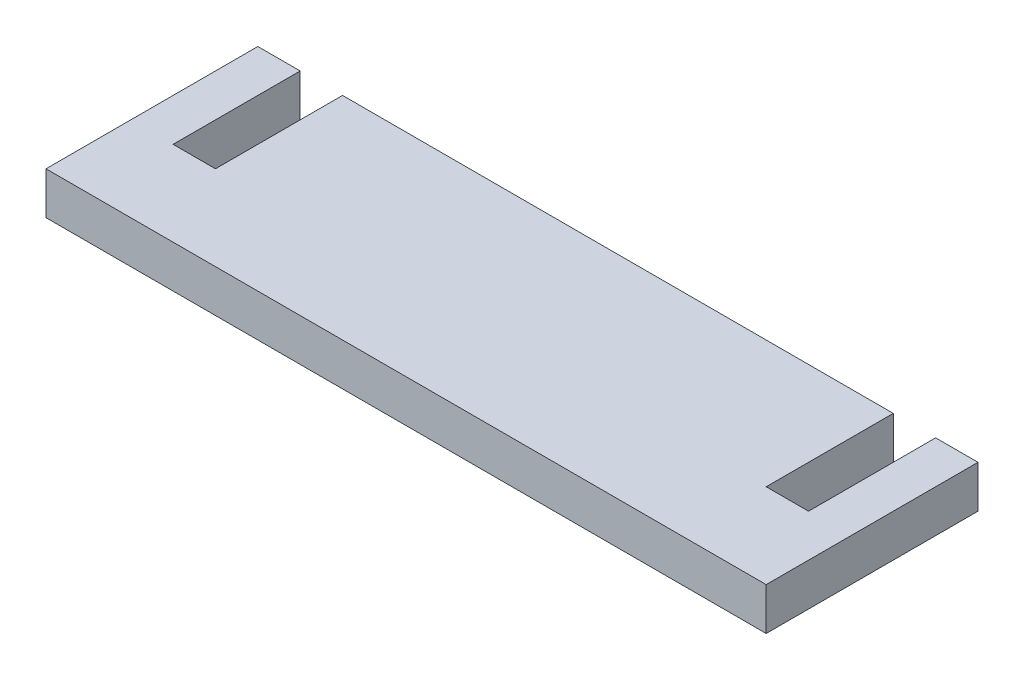
ISO-10303-21;
HEADER;
FILE_DESCRIPTION(('STEP AP214'),'2;1');
FILE_NAME('part.step','',(''),(''),'','','');
FILE_SCHEMA(('AUTOMOTIVE_DESIGN { 1 0 10303 214 1 1 1 1 }'));
ENDSEC;
DATA;
#1=APPLICATION_CONTEXT('core data for automotive mechanical design processes');
#2=APPLICATION_PROTOCOL_DEFINITION('international standard','automotive_design',2000,#1);
#3=PRODUCT_CONTEXT('',#1,'mechanical');
#4=PRODUCT('Part','Part','',(#3));
#5=PRODUCT_RELATED_PRODUCT_CATEGORY('part','',(#4));
#6=PRODUCT_DEFINITION_FORMATION('','',#4);
#7=PRODUCT_DEFINITION_CONTEXT('part definition',#1,'design');
#8=PRODUCT_DEFINITION('design','',#6,#7);
#9=PRODUCT_DEFINITION_SHAPE('','',#8);
#10=(LENGTH_UNIT() NAMED_UNIT(*) SI_UNIT(.MILLI.,.METRE.));
#11=(NAMED_UNIT(*) PLANE_ANGLE_UNIT() SI_UNIT($,.RADIAN.));
#12=(NAMED_UNIT(*) SI_UNIT($,.STERADIAN.) SOLID_ANGLE_UNIT());
#13=UNCERTAINTY_MEASURE_WITH_UNIT(LENGTH_MEASURE(1.E-05),#10,'distance_accuracy_value','');
#14=(GEOMETRIC_REPRESENTATION_CONTEXT(3) GLOBAL_UNCERTAINTY_ASSIGNED_CONTEXT((#13)) GLOBAL_UNIT_ASSIGNED_CONTEXT((#10,
#11,#12)) REPRESENTATION_CONTEXT('',''));
#15=CARTESIAN_POINT('',(0.,0.,0.));
#16=DIRECTION('',(0.,0.,1.));
#17=DIRECTION('',(1.,0.,0.));
#18=AXIS2_PLACEMENT_3D('',#15,#16,#17);
#19=CARTESIAN_POINT('',(0.,254.,-1270.));
#20=DIRECTION('',(-1.,0.,0.));
#21=DIRECTION('',(0.,0.,1.));
#22=AXIS2_PLACEMENT_3D('',#19,#20,#21);
#23=PLANE('',#22);
#24=DIRECTION('',(0.,0.,-1.));
#25=VECTOR('',#24,1.);
#26=CARTESIAN_POINT('',(0.,0.,-1270.));
#27=LINE('',#26,#25);
#28=CARTESIAN_POINT('',(0.,0.,0.));
#29=VERTEX_POINT('',#28);
#30=CARTESIAN_POINT('',(0.,0.,-1270.));
#31=VERTEX_POINT('',#30);
#32=EDGE_CURVE('E153',#29,#31,#27,.T.);
#33=ORIENTED_EDGE('',*,*,#32,.T.);
#34=DIRECTION('',(0.,-1.,0.));
#35=VECTOR('',#34,1.);
#36=CARTESIAN_POINT('',(0.,254.,-1270.));
#37=LINE('',#36,#35);
#38=CARTESIAN_POINT('',(0.,254.,-1270.));
#39=VERTEX_POINT('',#38);
#40=EDGE_CURVE('E11',#39,#31,#37,.T.);
#41=ORIENTED_EDGE('',*,*,#40,.F.);
#42=DIRECTION('',(0.,0.,-1.));
#43=VECTOR('',#42,1.);
#44=CARTESIAN_POINT('',(0.,254.,-1270.));
#45=LINE('',#44,#43);
#46=CARTESIAN_POINT('',(0.,254.,0.));
#47=VERTEX_POINT('',#46);
#48=EDGE_CURVE('E175',#47,#39,#45,.T.);
#49=ORIENTED_EDGE('',*,*,#48,.F.);
#50=DIRECTION('',(0.,-1.,0.));
#51=VECTOR('',#50,1.);
#52=CARTESIAN_POINT('',(0.,254.,0.));
#53=LINE('',#52,#51);
#54=EDGE_CURVE('E149',#47,#29,#53,.T.);
#55=ORIENTED_EDGE('',*,*,#54,.T.);
#56=EDGE_LOOP('',(#33,#41,#49,#55));
#57=FACE_BOUND('',#56,.T.);
#58=ADVANCED_FACE('F33',(#57),#23,.F.);
#59=CARTESIAN_POINT('',(-254.,254.,-1270.));
#60=DIRECTION('',(0.,0.,1.));
#61=DIRECTION('',(1.,0.,0.));
#62=AXIS2_PLACEMENT_3D('',#59,#60,#61);
#63=PLANE('',#62);
#64=DIRECTION('',(-1.,0.,0.));
#65=VECTOR('',#64,1.);
#66=CARTESIAN_POINT('',(-254.,0.,-1270.));
#67=LINE('',#66,#65);
#68=CARTESIAN_POINT('',(-254.,0.,-1270.));
#69=VERTEX_POINT('',#68);
#70=EDGE_CURVE('E156',#31,#69,#67,.T.);
#71=ORIENTED_EDGE('',*,*,#70,.T.);
#72=DIRECTION('',(0.,-1.,0.));
#73=VECTOR('',#72,1.);
#74=CARTESIAN_POINT('',(-254.,254.,-1270.));
#75=LINE('',#74,#73);
#76=CARTESIAN_POINT('',(-254.,254.,-1270.));
#77=VERTEX_POINT('',#76);
#78=EDGE_CURVE('E41',#77,#69,#75,.T.);
#79=ORIENTED_EDGE('',*,*,#78,.F.);
#80=DIRECTION('',(-1.,0.,0.));
#81=VECTOR('',#80,1.);
#82=CARTESIAN_POINT('',(-254.,254.,-1270.));
#83=LINE('',#82,#81);
#84=EDGE_CURVE('E104',#39,#77,#83,.T.);
#85=ORIENTED_EDGE('',*,*,#84,.F.);
#86=ORIENTED_EDGE('',*,*,#40,.T.);
#87=EDGE_LOOP('',(#71,#79,#85,#86));
#88=FACE_BOUND('',#87,.T.);
#89=ADVANCED_FACE('F253',(#88),#63,.F.);
#90=CARTESIAN_POINT('',(-254.,254.,-508.));
#91=DIRECTION('',(1.,0.,0.));
#92=DIRECTION('',(0.,0.,-1.));
#93=AXIS2_PLACEMENT_3D('',#90,#91,#92);
#94=PLANE('',#93);
#95=DIRECTION('',(0.,0.,1.));
#96=VECTOR('',#95,1.);
#97=CARTESIAN_POINT('',(-254.,0.,-508.));
#98=LINE('',#97,#96);
#99=CARTESIAN_POINT('',(-254.,0.,-508.));
#100=VERTEX_POINT('',#99);
#101=EDGE_CURVE('E158',#69,#100,#98,.T.);
#102=ORIENTED_EDGE('',*,*,#101,.T.);
#103=DIRECTION('',(0.,-1.,0.));
#104=VECTOR('',#103,1.);
#105=CARTESIAN_POINT('',(-254.,254.,-508.));
#106=LINE('',#105,#104);
#107=CARTESIAN_POINT('',(-254.,254.,-508.));
#108=VERTEX_POINT('',#107);
#109=EDGE_CURVE('E194',#108,#100,#106,.T.);
#110=ORIENTED_EDGE('',*,*,#109,.F.);
#111=DIRECTION('',(0.,0.,1.));
#112=VECTOR('',#111,1.);
#113=CARTESIAN_POINT('',(-254.,254.,-508.));
#114=LINE('',#113,#112);
#115=EDGE_CURVE('E202',#77,#108,#114,.T.);
#116=ORIENTED_EDGE('',*,*,#115,.F.);
#117=ORIENTED_EDGE('',*,*,#78,.T.);
#118=EDGE_LOOP('',(#102,#110,#116,#117));
#119=FACE_BOUND('',#118,.T.);
#120=ADVANCED_FACE('F200',(#119),#94,.F.);
#121=CARTESIAN_POINT('',(-508.,254.,-508.));
#122=DIRECTION('',(0.,0.,1.));
#123=DIRECTION('',(1.,0.,0.));
#124=AXIS2_PLACEMENT_3D('',#121,#122,#123);
#125=PLANE('',#124);
#126=DIRECTION('',(-1.,0.,0.));
#127=VECTOR('',#126,1.);
#128=CARTESIAN_POINT('',(-508.,0.,-508.));
#129=LINE('',#128,#127);
#130=CARTESIAN_POINT('',(-508.,0.,-508.));
#131=VERTEX_POINT('',#130);
#132=EDGE_CURVE('E160',#100,#131,#129,.T.);
#133=ORIENTED_EDGE('',*,*,#132,.T.);
#134=DIRECTION('',(0.,-1.,0.));
#135=VECTOR('',#134,1.);
#136=CARTESIAN_POINT('',(-508.,254.,-508.));
#137=LINE('',#136,#135);
#138=CARTESIAN_POINT('',(-508.,254.,-508.));
#139=VERTEX_POINT('',#138);
#140=EDGE_CURVE('E191',#139,#131,#137,.T.);
#141=ORIENTED_EDGE('',*,*,#140,.F.);
#142=DIRECTION('',(-1.,0.,0.));
#143=VECTOR('',#142,1.);
#144=CARTESIAN_POINT('',(-508.,254.,-508.));
#145=LINE('',#144,#143);
#146=EDGE_CURVE('E220',#108,#139,#145,.T.);
#147=ORIENTED_EDGE('',*,*,#146,.F.);
#148=ORIENTED_EDGE('',*,*,#109,.T.);
#149=EDGE_LOOP('',(#133,#141,#147,#148));
#150=FACE_BOUND('',#149,.T.);
#151=ADVANCED_FACE('F211',(#150),#125,.F.);
#152=CARTESIAN_POINT('',(-508.,254.,-1270.));
#153=DIRECTION('',(-1.,0.,0.));
#154=DIRECTION('',(0.,0.,1.));
#155=AXIS2_PLACEMENT_3D('',#152,#153,#154);
#156=PLANE('',#155);
#157=DIRECTION('',(0.,0.,-1.));
#158=VECTOR('',#157,1.);
#159=CARTESIAN_POINT('',(-508.,0.,-1270.));
#160=LINE('',#159,#158);
#161=CARTESIAN_POINT('',(-508.,0.,-1270.));
#162=VERTEX_POINT('',#161);
#163=EDGE_CURVE('E162',#131,#162,#160,.T.);
#164=ORIENTED_EDGE('',*,*,#163,.T.);
#165=DIRECTION('',(0.,-1.,0.));
#166=VECTOR('',#165,1.);
#167=CARTESIAN_POINT('',(-508.,254.,-1270.));
#168=LINE('',#167,#166);
#169=CARTESIAN_POINT('',(-508.,254.,-1270.));
#170=VERTEX_POINT('',#169);
#171=EDGE_CURVE('E188',#170,#162,#168,.T.);
#172=ORIENTED_EDGE('',*,*,#171,.F.);
#173=DIRECTION('',(0.,0.,-1.));
#174=VECTOR('',#173,1.);
#175=CARTESIAN_POINT('',(-508.,254.,-1270.));
#176=LINE('',#175,#174);
#177=EDGE_CURVE('E217',#139,#170,#176,.T.);
#178=ORIENTED_EDGE('',*,*,#177,.F.);
#179=ORIENTED_EDGE('',*,*,#140,.T.);
#180=EDGE_LOOP('',(#164,#172,#178,#179));
#181=FACE_BOUND('',#180,.T.);
#182=ADVANCED_FACE('F215',(#181),#156,.F.);
#183=CARTESIAN_POINT('',(-3810.,254.,-1270.));
#184=DIRECTION('',(0.,0.,1.));
#185=DIRECTION('',(1.,0.,0.));
#186=AXIS2_PLACEMENT_3D('',#183,#184,#185);
#187=PLANE('',#186);
#188=DIRECTION('',(-1.,0.,0.));
#189=VECTOR('',#188,1.);
#190=CARTESIAN_POINT('',(-3810.,0.,-1270.));
#191=LINE('',#190,#189);
#192=CARTESIAN_POINT('',(-3810.,0.,-1270.));
#193=VERTEX_POINT('',#192);
#194=EDGE_CURVE('E164',#162,#193,#191,.T.);
#195=ORIENTED_EDGE('',*,*,#194,.T.);
#196=DIRECTION('',(0.,-1.,0.));
#197=VECTOR('',#196,1.);
#198=CARTESIAN_POINT('',(-3810.,254.,-1270.));
#199=LINE('',#198,#197);
#200=CARTESIAN_POINT('',(-3810.,254.,-1270.));
#201=VERTEX_POINT('',#200);
#202=EDGE_CURVE('E185',#201,#193,#199,.T.);
#203=ORIENTED_EDGE('',*,*,#202,.F.);
#204=DIRECTION('',(-1.,0.,0.));
#205=VECTOR('',#204,1.);
#206=CARTESIAN_POINT('',(-3810.,254.,-1270.));
#207=LINE('',#206,#205);
#208=EDGE_CURVE('E219',#170,#201,#207,.T.);
#209=ORIENTED_EDGE('',*,*,#208,.F.);
#210=ORIENTED_EDGE('',*,*,#171,.T.);
#211=EDGE_LOOP('',(#195,#203,#209,#210));
#212=FACE_BOUND('',#211,.T.);
#213=ADVANCED_FACE('F266',(#212),#187,.F.);
#214=CARTESIAN_POINT('',(-3810.,254.,-507.999999999999));
#215=DIRECTION('',(1.,0.,0.));
#216=DIRECTION('',(0.,0.,-1.));
#217=AXIS2_PLACEMENT_3D('',#214,#215,#216);
#218=PLANE('',#217);
#219=DIRECTION('',(0.,0.,1.));
#220=VECTOR('',#219,1.);
#221=CARTESIAN_POINT('',(-3810.,0.,-507.999999999999));
#222=LINE('',#221,#220);
#223=CARTESIAN_POINT('',(-3810.,0.,-507.999999999999));
#224=VERTEX_POINT('',#223);
#225=EDGE_CURVE('E166',#193,#224,#222,.T.);
#226=ORIENTED_EDGE('',*,*,#225,.T.);
#227=DIRECTION('',(0.,-1.,0.));
#228=VECTOR('',#227,1.);
#229=CARTESIAN_POINT('',(-3810.,254.,-507.999999999999));
#230=LINE('',#229,#228);
#231=CARTESIAN_POINT('',(-3810.,254.,-507.999999999999));
#232=VERTEX_POINT('',#231);
#233=EDGE_CURVE('E182',#232,#224,#230,.T.);
#234=ORIENTED_EDGE('',*,*,#233,.F.);
#235=DIRECTION('',(0.,0.,1.));
#236=VECTOR('',#235,1.);
#237=CARTESIAN_POINT('',(-3810.,254.,-507.999999999999));
#238=LINE('',#237,#236);
#239=EDGE_CURVE('E222',#201,#232,#238,.T.);
#240=ORIENTED_EDGE('',*,*,#239,.F.);
#241=ORIENTED_EDGE('',*,*,#202,.T.);
#242=EDGE_LOOP('',(#226,#234,#240,#241));
#243=FACE_BOUND('',#242,.T.);
#244=ADVANCED_FACE('F269',(#243),#218,.F.);
#245=CARTESIAN_POINT('',(-4064.,254.,-508.));
#246=DIRECTION('',(0.,0.,1.));
#247=DIRECTION('',(1.,0.,0.));
#248=AXIS2_PLACEMENT_3D('',#245,#246,#247);
#249=PLANE('',#248);
#250=DIRECTION('',(-1.,0.,0.));
#251=VECTOR('',#250,1.);
#252=CARTESIAN_POINT('',(-4064.,0.,-508.));
#253=LINE('',#252,#251);
#254=CARTESIAN_POINT('',(-4064.,0.,-508.));
#255=VERTEX_POINT('',#254);
#256=EDGE_CURVE('E168',#224,#255,#253,.T.);
#257=ORIENTED_EDGE('',*,*,#256,.T.);
#258=DIRECTION('',(0.,-1.,0.));
#259=VECTOR('',#258,1.);
#260=CARTESIAN_POINT('',(-4064.,254.,-508.));
#261=LINE('',#260,#259);
#262=CARTESIAN_POINT('',(-4064.,254.,-508.));
#263=VERTEX_POINT('',#262);
#264=EDGE_CURVE('E179',#263,#255,#261,.T.);
#265=ORIENTED_EDGE('',*,*,#264,.F.);
#266=DIRECTION('',(-1.,0.,0.));
#267=VECTOR('',#266,1.);
#268=CARTESIAN_POINT('',(-4064.,254.,-508.));
#269=LINE('',#268,#267);
#270=EDGE_CURVE('E228',#232,#263,#269,.T.);
#271=ORIENTED_EDGE('',*,*,#270,.F.);
#272=ORIENTED_EDGE('',*,*,#233,.T.);
#273=EDGE_LOOP('',(#257,#265,#271,#272));
#274=FACE_BOUND('',#273,.T.);
#275=ADVANCED_FACE('F234',(#274),#249,.F.);
#276=CARTESIAN_POINT('',(-4064.,254.,-1270.));
#277=DIRECTION('',(-1.,0.,0.));
#278=DIRECTION('',(0.,0.,1.));
#279=AXIS2_PLACEMENT_3D('',#276,#277,#278);
#280=PLANE('',#279);
#281=DIRECTION('',(0.,0.,-1.));
#282=VECTOR('',#281,1.);
#283=CARTESIAN_POINT('',(-4064.,0.,-1270.));
#284=LINE('',#283,#282);
#285=CARTESIAN_POINT('',(-4064.,0.,-1270.));
#286=VERTEX_POINT('',#285);
#287=EDGE_CURVE('E170',#255,#286,#284,.T.);
#288=ORIENTED_EDGE('',*,*,#287,.T.);
#289=DIRECTION('',(0.,-1.,0.));
#290=VECTOR('',#289,1.);
#291=CARTESIAN_POINT('',(-4064.,254.,-1270.));
#292=LINE('',#291,#290);
#293=CARTESIAN_POINT('',(-4064.,254.,-1270.));
#294=VERTEX_POINT('',#293);
#295=EDGE_CURVE('E144',#294,#286,#292,.T.);
#296=ORIENTED_EDGE('',*,*,#295,.F.);
#297=DIRECTION('',(0.,0.,-1.));
#298=VECTOR('',#297,1.);
#299=CARTESIAN_POINT('',(-4064.,254.,-1270.));
#300=LINE('',#299,#298);
#301=EDGE_CURVE('E135',#263,#294,#300,.T.);
#302=ORIENTED_EDGE('',*,*,#301,.F.);
#303=ORIENTED_EDGE('',*,*,#264,.T.);
#304=EDGE_LOOP('',(#288,#296,#302,#303));
#305=FACE_BOUND('',#304,.T.);
#306=ADVANCED_FACE('F238',(#305),#280,.F.);
#307=CARTESIAN_POINT('',(-4318.,254.,-1270.));
#308=DIRECTION('',(0.,0.,1.));
#309=DIRECTION('',(1.,0.,0.));
#310=AXIS2_PLACEMENT_3D('',#307,#308,#309);
#311=PLANE('',#310);
#312=DIRECTION('',(-1.,0.,0.));
#313=VECTOR('',#312,1.);
#314=CARTESIAN_POINT('',(-4318.,0.,-1270.));
#315=LINE('',#314,#313);
#316=CARTESIAN_POINT('',(-4318.,0.,-1270.));
#317=VERTEX_POINT('',#316);
#318=EDGE_CURVE('E143',#286,#317,#315,.T.);
#319=ORIENTED_EDGE('',*,*,#318,.T.);
#320=DIRECTION('',(0.,-1.,0.));
#321=VECTOR('',#320,1.);
#322=CARTESIAN_POINT('',(-4318.,254.,-1270.));
#323=LINE('',#322,#321);
#324=CARTESIAN_POINT('',(-4318.,254.,-1270.));
#325=VERTEX_POINT('',#324);
#326=EDGE_CURVE('E140',#325,#317,#323,.T.);
#327=ORIENTED_EDGE('',*,*,#326,.F.);
#328=DIRECTION('',(-1.,0.,0.));
#329=VECTOR('',#328,1.);
#330=CARTESIAN_POINT('',(-4318.,254.,-1270.));
#331=LINE('',#330,#329);
#332=EDGE_CURVE('E129',#294,#325,#331,.T.);
#333=ORIENTED_EDGE('',*,*,#332,.F.);
#334=ORIENTED_EDGE('',*,*,#295,.T.);
#335=EDGE_LOOP('',(#319,#327,#333,#334));
#336=FACE_BOUND('',#335,.T.);
#337=ADVANCED_FACE('F141',(#336),#311,.F.);
#338=CARTESIAN_POINT('',(-4318.,254.,-1270.));
#339=DIRECTION('',(1.,0.,0.));
#340=DIRECTION('',(0.,0.,-1.));
#341=AXIS2_PLACEMENT_3D('',#338,#339,#340);
#342=PLANE('',#341);
#343=DIRECTION('',(0.,0.,1.));
#344=VECTOR('',#343,1.);
#345=CARTESIAN_POINT('',(-4318.,0.,-1270.));
#346=LINE('',#345,#344);
#347=CARTESIAN_POINT('',(-4318.,0.,0.));
#348=VERTEX_POINT('',#347);
#349=EDGE_CURVE('E90',#317,#348,#346,.T.);
#350=ORIENTED_EDGE('',*,*,#349,.T.);
#351=DIRECTION('',(0.,-1.,0.));
#352=VECTOR('',#351,1.);
#353=CARTESIAN_POINT('',(-4318.,254.,0.));
#354=LINE('',#353,#352);
#355=CARTESIAN_POINT('',(-4318.,254.,0.));
#356=VERTEX_POINT('',#355);
#357=EDGE_CURVE('E145',#356,#348,#354,.T.);
#358=ORIENTED_EDGE('',*,*,#357,.F.);
#359=DIRECTION('',(0.,0.,1.));
#360=VECTOR('',#359,1.);
#361=CARTESIAN_POINT('',(-4318.,254.,-1270.));
#362=LINE('',#361,#360);
#363=EDGE_CURVE('E133',#325,#356,#362,.T.);
#364=ORIENTED_EDGE('',*,*,#363,.F.);
#365=ORIENTED_EDGE('',*,*,#326,.T.);
#366=EDGE_LOOP('',(#350,#358,#364,#365));
#367=FACE_BOUND('',#366,.T.);
#368=ADVANCED_FACE('F147',(#367),#342,.F.);
#369=CARTESIAN_POINT('',(0.,254.,0.));
#370=DIRECTION('',(0.,0.,-1.));
#371=DIRECTION('',(-1.,0.,0.));
#372=AXIS2_PLACEMENT_3D('',#369,#370,#371);
#373=PLANE('',#372);
#374=DIRECTION('',(1.,0.,0.));
#375=VECTOR('',#374,1.);
#376=CARTESIAN_POINT('',(0.,0.,0.));
#377=LINE('',#376,#375);
#378=EDGE_CURVE('E96',#348,#29,#377,.T.);
#379=ORIENTED_EDGE('',*,*,#378,.T.);
#380=ORIENTED_EDGE('',*,*,#54,.F.);
#381=DIRECTION('',(1.,0.,0.));
#382=VECTOR('',#381,1.);
#383=CARTESIAN_POINT('',(0.,254.,0.));
#384=LINE('',#383,#382);
#385=EDGE_CURVE('E49',#356,#47,#384,.T.);
#386=ORIENTED_EDGE('',*,*,#385,.F.);
#387=ORIENTED_EDGE('',*,*,#357,.T.);
#388=EDGE_LOOP('',(#379,#380,#386,#387));
#389=FACE_BOUND('',#388,.T.);
#390=ADVANCED_FACE('F242',(#389),#373,.F.);
#391=CARTESIAN_POINT('',(0.,254.,0.));
#392=DIRECTION('',(0.,-1.,0.));
#393=DIRECTION('',(0.,0.,-1.));
#394=AXIS2_PLACEMENT_3D('',#391,#392,#393);
#395=PLANE('',#394);
#396=ORIENTED_EDGE('',*,*,#48,.T.);
#397=ORIENTED_EDGE('',*,*,#84,.T.);
#398=ORIENTED_EDGE('',*,*,#115,.T.);
#399=ORIENTED_EDGE('',*,*,#146,.T.);
#400=ORIENTED_EDGE('',*,*,#177,.T.);
#401=ORIENTED_EDGE('',*,*,#208,.T.);
#402=ORIENTED_EDGE('',*,*,#239,.T.);
#403=ORIENTED_EDGE('',*,*,#270,.T.);
#404=ORIENTED_EDGE('',*,*,#301,.T.);
#405=ORIENTED_EDGE('',*,*,#332,.T.);
#406=ORIENTED_EDGE('',*,*,#363,.T.);
#407=ORIENTED_EDGE('',*,*,#385,.T.);
#408=EDGE_LOOP('',(#396,#397,#398,#399,#400,#401,#402,#403,#404,#405,#406,#407));
#409=FACE_BOUND('',#408,.T.);
#410=ADVANCED_FACE('F131',(#409),#395,.F.);
#411=CARTESIAN_POINT('',(0.,0.,0.));
#412=DIRECTION('',(0.,-1.,0.));
#413=DIRECTION('',(0.,0.,-1.));
#414=AXIS2_PLACEMENT_3D('',#411,#412,#413);
#415=PLANE('',#414);
#416=ORIENTED_EDGE('',*,*,#32,.F.);
#417=ORIENTED_EDGE('',*,*,#378,.F.);
#418=ORIENTED_EDGE('',*,*,#349,.F.);
#419=ORIENTED_EDGE('',*,*,#318,.F.);
#420=ORIENTED_EDGE('',*,*,#287,.F.);
#421=ORIENTED_EDGE('',*,*,#256,.F.);
#422=ORIENTED_EDGE('',*,*,#225,.F.);
#423=ORIENTED_EDGE('',*,*,#194,.F.);
#424=ORIENTED_EDGE('',*,*,#163,.F.);
#425=ORIENTED_EDGE('',*,*,#132,.F.);
#426=ORIENTED_EDGE('',*,*,#101,.F.);
#427=ORIENTED_EDGE('',*,*,#70,.F.);
#428=EDGE_LOOP('',(#416,#417,#418,#419,#420,#421,#422,#423,#424,#425,#426,#427));
#429=FACE_BOUND('',#428,.T.);
#430=ADVANCED_FACE('F206',(#429),#415,.T.);
#431=CLOSED_SHELL('',(#58,#89,#120,#151,#182,#213,#244,#275,#306,#337,#368,#390,#410,#430));
#432=MANIFOLD_SOLID_BREP('B2',#431);
#433=ADVANCED_BREP_SHAPE_REPRESENTATION('',(#18,#432),#14);
#434=SHAPE_DEFINITION_REPRESENTATION(#9,#433);
ENDSEC;
END-ISO-10303-21;
